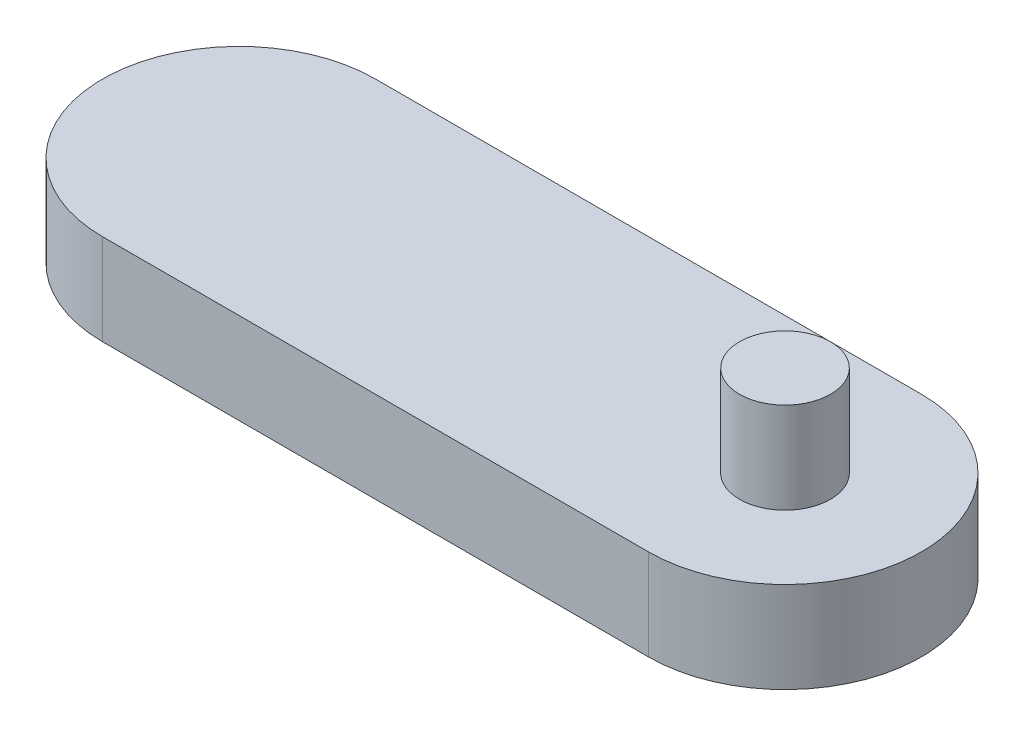
ISO-10303-21;
HEADER;
FILE_DESCRIPTION(('STEP AP214'),'2;1');
FILE_NAME('part.step','',(''),(''),'','','');
FILE_SCHEMA(('AUTOMOTIVE_DESIGN { 1 0 10303 214 1 1 1 1 }'));
ENDSEC;
DATA;
#1=APPLICATION_CONTEXT('core data for automotive mechanical design processes');
#2=APPLICATION_PROTOCOL_DEFINITION('international standard','automotive_design',2000,#1);
#3=PRODUCT_CONTEXT('',#1,'mechanical');
#4=PRODUCT('Part','Part','',(#3));
#5=PRODUCT_RELATED_PRODUCT_CATEGORY('part','',(#4));
#6=PRODUCT_DEFINITION_FORMATION('','',#4);
#7=PRODUCT_DEFINITION_CONTEXT('part definition',#1,'design');
#8=PRODUCT_DEFINITION('design','',#6,#7);
#9=PRODUCT_DEFINITION_SHAPE('','',#8);
#10=(LENGTH_UNIT() NAMED_UNIT(*) SI_UNIT(.MILLI.,.METRE.));
#11=(NAMED_UNIT(*) PLANE_ANGLE_UNIT() SI_UNIT($,.RADIAN.));
#12=(NAMED_UNIT(*) SI_UNIT($,.STERADIAN.) SOLID_ANGLE_UNIT());
#13=UNCERTAINTY_MEASURE_WITH_UNIT(LENGTH_MEASURE(1.E-05),#10,'distance_accuracy_value','');
#14=(GEOMETRIC_REPRESENTATION_CONTEXT(3) GLOBAL_UNCERTAINTY_ASSIGNED_CONTEXT((#13)) GLOBAL_UNIT_ASSIGNED_CONTEXT((#10,
#11,#12)) REPRESENTATION_CONTEXT('',''));
#15=CARTESIAN_POINT('',(0.,0.,0.));
#16=DIRECTION('',(0.,0.,1.));
#17=DIRECTION('',(1.,0.,0.));
#18=AXIS2_PLACEMENT_3D('',#15,#16,#17);
#19=CARTESIAN_POINT('',(-152.4,50.8,0.));
#20=DIRECTION('',(0.,-1.,0.));
#21=DIRECTION('',(0.,0.,-1.));
#22=AXIS2_PLACEMENT_3D('',#19,#20,#21);
#23=CYLINDRICAL_SURFACE('',#22,76.2000000000001);
#24=CARTESIAN_POINT('',(-152.4,0.,0.));
#25=DIRECTION('',(0.,1.,0.));
#26=DIRECTION('',(0.,0.,1.));
#27=AXIS2_PLACEMENT_3D('',#24,#25,#26);
#28=CIRCLE('',#27,76.2000000000001);
#29=CARTESIAN_POINT('',(-152.4,0.,-76.2));
#30=VERTEX_POINT('',#29);
#31=CARTESIAN_POINT('',(-152.4,0.,76.2000000000002));
#32=VERTEX_POINT('',#31);
#33=EDGE_CURVE('E101',#30,#32,#28,.T.);
#34=ORIENTED_EDGE('',*,*,#33,.T.);
#35=DIRECTION('',(0.,-1.,0.));
#36=VECTOR('',#35,1.);
#37=CARTESIAN_POINT('',(-152.4,50.8,76.2000000000002));
#38=LINE('',#37,#36);
#39=CARTESIAN_POINT('',(-152.4,50.8,76.2000000000002));
#40=VERTEX_POINT('',#39);
#41=EDGE_CURVE('E11',#40,#32,#38,.T.);
#42=ORIENTED_EDGE('',*,*,#41,.F.);
#43=CARTESIAN_POINT('',(-152.4,50.8,0.));
#44=DIRECTION('',(0.,1.,0.));
#45=DIRECTION('',(0.,0.,1.));
#46=AXIS2_PLACEMENT_3D('',#43,#44,#45);
#47=CIRCLE('',#46,76.2000000000001);
#48=CARTESIAN_POINT('',(-152.4,50.8,-76.2));
#49=VERTEX_POINT('',#48);
#50=EDGE_CURVE('E89',#49,#40,#47,.T.);
#51=ORIENTED_EDGE('',*,*,#50,.F.);
#52=DIRECTION('',(0.,-1.,0.));
#53=VECTOR('',#52,1.);
#54=CARTESIAN_POINT('',(-152.4,50.8,-76.2));
#55=LINE('',#54,#53);
#56=EDGE_CURVE('E97',#49,#30,#55,.T.);
#57=ORIENTED_EDGE('',*,*,#56,.T.);
#58=EDGE_LOOP('',(#34,#42,#51,#57));
#59=FACE_BOUND('',#58,.T.);
#60=ADVANCED_FACE('F38',(#59),#23,.T.);
#61=CARTESIAN_POINT('',(-152.4,50.8,76.2000000000002));
#62=DIRECTION('',(0.,0.,-1.));
#63=DIRECTION('',(-1.,0.,0.));
#64=AXIS2_PLACEMENT_3D('',#61,#62,#63);
#65=PLANE('',#64);
#66=DIRECTION('',(1.,0.,0.));
#67=VECTOR('',#66,1.);
#68=CARTESIAN_POINT('',(-152.4,0.,76.2000000000002));
#69=LINE('',#68,#67);
#70=CARTESIAN_POINT('',(152.4,0.,76.2));
#71=VERTEX_POINT('',#70);
#72=EDGE_CURVE('E93',#32,#71,#69,.T.);
#73=ORIENTED_EDGE('',*,*,#72,.T.);
#74=DIRECTION('',(0.,-1.,0.));
#75=VECTOR('',#74,1.);
#76=CARTESIAN_POINT('',(152.4,50.8,76.2));
#77=LINE('',#76,#75);
#78=CARTESIAN_POINT('',(152.4,50.8,76.2));
#79=VERTEX_POINT('',#78);
#80=EDGE_CURVE('E46',#79,#71,#77,.T.);
#81=ORIENTED_EDGE('',*,*,#80,.F.);
#82=DIRECTION('',(1.,0.,0.));
#83=VECTOR('',#82,1.);
#84=CARTESIAN_POINT('',(-152.4,50.8,76.2000000000002));
#85=LINE('',#84,#83);
#86=EDGE_CURVE('E84',#40,#79,#85,.T.);
#87=ORIENTED_EDGE('',*,*,#86,.F.);
#88=ORIENTED_EDGE('',*,*,#41,.T.);
#89=EDGE_LOOP('',(#73,#81,#87,#88));
#90=FACE_BOUND('',#89,.T.);
#91=ADVANCED_FACE('F92',(#90),#65,.F.);
#92=CARTESIAN_POINT('',(152.4,50.8,0.));
#93=DIRECTION('',(0.,-1.,0.));
#94=DIRECTION('',(0.,0.,-1.));
#95=AXIS2_PLACEMENT_3D('',#92,#93,#94);
#96=CYLINDRICAL_SURFACE('',#95,76.2000000000001);
#97=CARTESIAN_POINT('',(152.4,0.,0.));
#98=DIRECTION('',(0.,1.,0.));
#99=DIRECTION('',(0.,0.,1.));
#100=AXIS2_PLACEMENT_3D('',#97,#98,#99);
#101=CIRCLE('',#100,76.2000000000001);
#102=CARTESIAN_POINT('',(152.4,0.,-76.2000000000001));
#103=VERTEX_POINT('',#102);
#104=EDGE_CURVE('E71',#71,#103,#101,.T.);
#105=ORIENTED_EDGE('',*,*,#104,.T.);
#106=DIRECTION('',(0.,-1.,0.));
#107=VECTOR('',#106,1.);
#108=CARTESIAN_POINT('',(152.4,50.8,-76.2000000000001));
#109=LINE('',#108,#107);
#110=CARTESIAN_POINT('',(152.4,50.8,-76.2000000000001));
#111=VERTEX_POINT('',#110);
#112=EDGE_CURVE('E94',#111,#103,#109,.T.);
#113=ORIENTED_EDGE('',*,*,#112,.F.);
#114=CARTESIAN_POINT('',(152.4,50.8,0.));
#115=DIRECTION('',(0.,1.,0.));
#116=DIRECTION('',(0.,0.,1.));
#117=AXIS2_PLACEMENT_3D('',#114,#115,#116);
#118=CIRCLE('',#117,76.2000000000001);
#119=EDGE_CURVE('E87',#79,#111,#118,.T.);
#120=ORIENTED_EDGE('',*,*,#119,.F.);
#121=ORIENTED_EDGE('',*,*,#80,.T.);
#122=EDGE_LOOP('',(#105,#113,#120,#121));
#123=FACE_BOUND('',#122,.T.);
#124=ADVANCED_FACE('F95',(#123),#96,.T.);
#125=CARTESIAN_POINT('',(-152.4,50.8,-76.2));
#126=DIRECTION('',(0.,0.,1.));
#127=DIRECTION('',(1.,0.,0.));
#128=AXIS2_PLACEMENT_3D('',#125,#126,#127);
#129=PLANE('',#128);
#130=DIRECTION('',(-1.,0.,0.));
#131=VECTOR('',#130,1.);
#132=CARTESIAN_POINT('',(-152.4,0.,-76.2));
#133=LINE('',#132,#131);
#134=EDGE_CURVE('E77',#103,#30,#133,.T.);
#135=ORIENTED_EDGE('',*,*,#134,.T.);
#136=ORIENTED_EDGE('',*,*,#56,.F.);
#137=DIRECTION('',(-1.,0.,0.));
#138=VECTOR('',#137,1.);
#139=CARTESIAN_POINT('',(-152.4,50.8,-76.2));
#140=LINE('',#139,#138);
#141=EDGE_CURVE('E54',#111,#49,#140,.T.);
#142=ORIENTED_EDGE('',*,*,#141,.F.);
#143=ORIENTED_EDGE('',*,*,#112,.T.);
#144=EDGE_LOOP('',(#135,#136,#142,#143));
#145=FACE_BOUND('',#144,.T.);
#146=ADVANCED_FACE('F109',(#145),#129,.F.);
#147=CARTESIAN_POINT('',(-152.4,50.8,0.));
#148=DIRECTION('',(0.,1.,0.));
#149=DIRECTION('',(0.,0.,1.));
#150=AXIS2_PLACEMENT_3D('',#147,#148,#149);
#151=PLANE('',#150);
#152=CARTESIAN_POINT('',(152.4,50.8,0.));
#153=DIRECTION('',(0.,1.,0.));
#154=DIRECTION('',(0.,0.,1.));
#155=AXIS2_PLACEMENT_3D('',#152,#153,#154);
#156=CIRCLE('',#155,25.4);
#157=CARTESIAN_POINT('',(152.4,50.8,25.4));
#158=VERTEX_POINT('',#157);
#159=EDGE_CURVE('E121',#158,#158,#156,.T.);
#160=ORIENTED_EDGE('',*,*,#159,.F.);
#161=EDGE_LOOP('',(#160));
#162=FACE_BOUND('',#161,.T.);
#163=ORIENTED_EDGE('',*,*,#50,.T.);
#164=ORIENTED_EDGE('',*,*,#86,.T.);
#165=ORIENTED_EDGE('',*,*,#119,.T.);
#166=ORIENTED_EDGE('',*,*,#141,.T.);
#167=EDGE_LOOP('',(#163,#164,#165,#166));
#168=FACE_BOUND('',#167,.T.);
#169=ADVANCED_FACE('F85',(#162,#168),#151,.T.);
#170=CARTESIAN_POINT('',(-152.4,0.,0.));
#171=DIRECTION('',(0.,1.,0.));
#172=DIRECTION('',(0.,0.,1.));
#173=AXIS2_PLACEMENT_3D('',#170,#171,#172);
#174=PLANE('',#173);
#175=CARTESIAN_POINT('',(-152.4,0.,0.));
#176=DIRECTION('',(0.,-1.,0.));
#177=DIRECTION('',(0.,0.,-1.));
#178=AXIS2_PLACEMENT_3D('',#175,#176,#177);
#179=CIRCLE('',#178,50.8);
#180=CARTESIAN_POINT('',(-152.4,0.,-50.8));
#181=VERTEX_POINT('',#180);
#182=EDGE_CURVE('E115',#181,#181,#179,.T.);
#183=ORIENTED_EDGE('',*,*,#182,.F.);
#184=EDGE_LOOP('',(#183));
#185=FACE_BOUND('',#184,.T.);
#186=ORIENTED_EDGE('',*,*,#33,.F.);
#187=ORIENTED_EDGE('',*,*,#134,.F.);
#188=ORIENTED_EDGE('',*,*,#104,.F.);
#189=ORIENTED_EDGE('',*,*,#72,.F.);
#190=EDGE_LOOP('',(#186,#187,#188,#189));
#191=FACE_BOUND('',#190,.T.);
#192=ADVANCED_FACE('F112',(#185,#191),#174,.F.);
#193=CARTESIAN_POINT('',(-152.4,25.4,0.));
#194=DIRECTION('',(0.,-1.,0.));
#195=DIRECTION('',(0.,0.,-1.));
#196=AXIS2_PLACEMENT_3D('',#193,#194,#195);
#197=CYLINDRICAL_SURFACE('',#196,50.8);
#198=CARTESIAN_POINT('',(-152.4,25.4,0.));
#199=DIRECTION('',(0.,-1.,0.));
#200=DIRECTION('',(0.,0.,-1.));
#201=AXIS2_PLACEMENT_3D('',#198,#199,#200);
#202=CIRCLE('',#201,50.8);
#203=CARTESIAN_POINT('',(-152.4,25.4,-50.8));
#204=VERTEX_POINT('',#203);
#205=EDGE_CURVE('E104',#204,#204,#202,.T.);
#206=ORIENTED_EDGE('',*,*,#205,.F.);
#207=EDGE_LOOP('',(#206));
#208=FACE_BOUND('',#207,.T.);
#209=ORIENTED_EDGE('',*,*,#182,.T.);
#210=EDGE_LOOP('',(#209));
#211=FACE_BOUND('',#210,.T.);
#212=ADVANCED_FACE('F142',(#208,#211),#197,.F.);
#213=CARTESIAN_POINT('',(-152.4,25.4,0.));
#214=DIRECTION('',(0.,-1.,0.));
#215=DIRECTION('',(0.,0.,-1.));
#216=AXIS2_PLACEMENT_3D('',#213,#214,#215);
#217=PLANE('',#216);
#218=ORIENTED_EDGE('',*,*,#205,.T.);
#219=EDGE_LOOP('',(#218));
#220=FACE_BOUND('',#219,.T.);
#221=ADVANCED_FACE('F132',(#220),#217,.T.);
#222=CARTESIAN_POINT('',(152.4,101.6,0.));
#223=DIRECTION('',(0.,-1.,0.));
#224=DIRECTION('',(0.,0.,-1.));
#225=AXIS2_PLACEMENT_3D('',#222,#223,#224);
#226=CYLINDRICAL_SURFACE('',#225,25.4);
#227=CARTESIAN_POINT('',(152.4,101.6,0.));
#228=DIRECTION('',(0.,1.,0.));
#229=DIRECTION('',(0.,0.,1.));
#230=AXIS2_PLACEMENT_3D('',#227,#228,#229);
#231=CIRCLE('',#230,25.4);
#232=CARTESIAN_POINT('',(152.4,101.6,25.4));
#233=VERTEX_POINT('',#232);
#234=EDGE_CURVE('E118',#233,#233,#231,.T.);
#235=ORIENTED_EDGE('',*,*,#234,.F.);
#236=EDGE_LOOP('',(#235));
#237=FACE_BOUND('',#236,.T.);
#238=ORIENTED_EDGE('',*,*,#159,.T.);
#239=EDGE_LOOP('',(#238));
#240=FACE_BOUND('',#239,.T.);
#241=ADVANCED_FACE('F129',(#237,#240),#226,.T.);
#242=CARTESIAN_POINT('',(152.4,101.6,0.));
#243=DIRECTION('',(0.,1.,0.));
#244=DIRECTION('',(0.,0.,1.));
#245=AXIS2_PLACEMENT_3D('',#242,#243,#244);
#246=PLANE('',#245);
#247=ORIENTED_EDGE('',*,*,#234,.T.);
#248=EDGE_LOOP('',(#247));
#249=FACE_BOUND('',#248,.T.);
#250=ADVANCED_FACE('F127',(#249),#246,.T.);
#251=CLOSED_SHELL('',(#60,#91,#124,#146,#169,#192,#212,#221,#241,#250));
#252=MANIFOLD_SOLID_BREP('B2',#251);
#253=ADVANCED_BREP_SHAPE_REPRESENTATION('',(#18,#252),#14);
#254=SHAPE_DEFINITION_REPRESENTATION(#9,#253);
ENDSEC;
END-ISO-10303-21;
